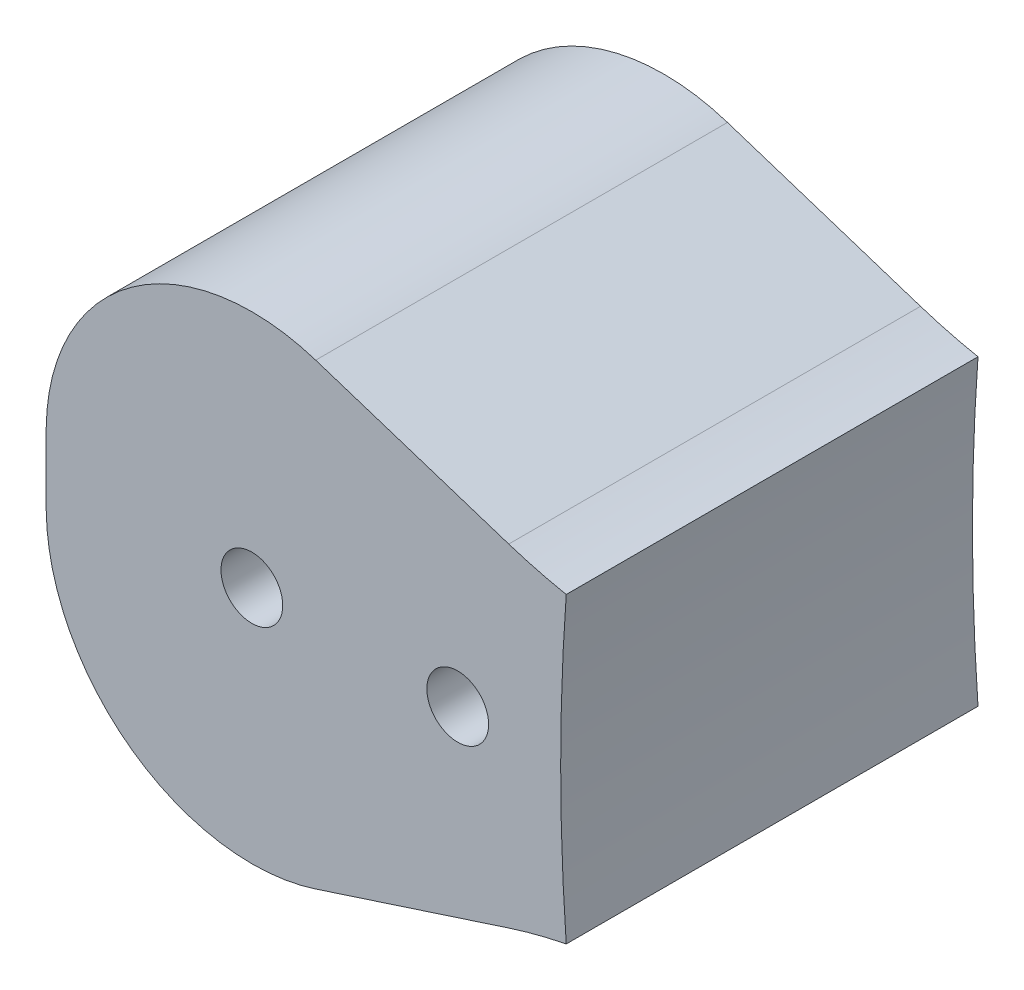
ISO-10303-21;
HEADER;
FILE_DESCRIPTION(('STEP AP214'),'2;1');
FILE_NAME('part.step','',(''),(''),'','','');
FILE_SCHEMA(('AUTOMOTIVE_DESIGN { 1 0 10303 214 1 1 1 1 }'));
ENDSEC;
DATA;
#1=APPLICATION_CONTEXT('core data for automotive mechanical design processes');
#2=APPLICATION_PROTOCOL_DEFINITION('international standard','automotive_design',2000,#1);
#3=PRODUCT_CONTEXT('',#1,'mechanical');
#4=PRODUCT('Part','Part','',(#3));
#5=PRODUCT_RELATED_PRODUCT_CATEGORY('part','',(#4));
#6=PRODUCT_DEFINITION_FORMATION('','',#4);
#7=PRODUCT_DEFINITION_CONTEXT('part definition',#1,'design');
#8=PRODUCT_DEFINITION('design','',#6,#7);
#9=PRODUCT_DEFINITION_SHAPE('','',#8);
#10=(LENGTH_UNIT() NAMED_UNIT(*) SI_UNIT(.MILLI.,.METRE.));
#11=(NAMED_UNIT(*) PLANE_ANGLE_UNIT() SI_UNIT($,.RADIAN.));
#12=(NAMED_UNIT(*) SI_UNIT($,.STERADIAN.) SOLID_ANGLE_UNIT());
#13=UNCERTAINTY_MEASURE_WITH_UNIT(LENGTH_MEASURE(1.E-05),#10,'distance_accuracy_value','');
#14=(GEOMETRIC_REPRESENTATION_CONTEXT(3) GLOBAL_UNCERTAINTY_ASSIGNED_CONTEXT((#13)) GLOBAL_UNIT_ASSIGNED_CONTEXT((#10,
#11,#12)) REPRESENTATION_CONTEXT('',''));
#15=CARTESIAN_POINT('',(0.,0.,0.));
#16=DIRECTION('',(0.,0.,1.));
#17=DIRECTION('',(1.,0.,0.));
#18=AXIS2_PLACEMENT_3D('',#15,#16,#17);
#19=CARTESIAN_POINT('',(0.,0.,20.));
#20=DIRECTION('',(0.,0.,1.));
#21=DIRECTION('',(1.,0.,0.));
#22=AXIS2_PLACEMENT_3D('',#19,#20,#21);
#23=PLANE('',#22);
#24=CARTESIAN_POINT('',(-105.,3.71230823859037E-13,20.));
#25=DIRECTION('',(0.,0.,1.));
#26=DIRECTION('',(1.,0.,0.));
#27=AXIS2_PLACEMENT_3D('',#24,#25,#26);
#28=CIRCLE('',#27,1.49999999999995);
#29=CARTESIAN_POINT('',(-103.5,3.71230823859037E-13,20.));
#30=VERTEX_POINT('',#29);
#31=EDGE_CURVE('E136',#30,#30,#28,.T.);
#32=ORIENTED_EDGE('',*,*,#31,.F.);
#33=EDGE_LOOP('',(#32));
#34=FACE_BOUND('',#33,.T.);
#35=CARTESIAN_POINT('',(0.,0.,20.));
#36=DIRECTION('',(0.,0.,-1.));
#37=DIRECTION('',(1.,0.,0.));
#38=AXIS2_PLACEMENT_3D('',#35,#36,#37);
#39=CIRCLE('',#38,100.);
#40=CARTESIAN_POINT('',(-99.7294249610009,-7.3513126003521,20.));
#41=VERTEX_POINT('',#40);
#42=CARTESIAN_POINT('',(-99.7294249610009,7.35131260035246,20.));
#43=VERTEX_POINT('',#42);
#44=EDGE_CURVE('E147',#41,#43,#39,.T.);
#45=ORIENTED_EDGE('',*,*,#44,.T.);
#46=CARTESIAN_POINT('',(-95.1056516295152,30.9016994374951,20.));
#47=DIRECTION('',(0.,0.,-1.));
#48=DIRECTION('',(1.,0.,0.));
#49=AXIS2_PLACEMENT_3D('',#46,#47,#48);
#50=CIRCLE('',#49,24.0000000000004);
#51=CARTESIAN_POINT('',(-102.522059494514,8.07634304641088,20.));
#52=VERTEX_POINT('',#51);
#53=EDGE_CURVE('E95',#43,#52,#50,.T.);
#54=ORIENTED_EDGE('',*,*,#53,.T.);
#55=DIRECTION('',(-0.951056516295158,0.309016994374935,0.));
#56=VECTOR('',#55,1.);
#57=CARTESIAN_POINT('',(-102.522059494514,8.07634304641088,20.));
#58=LINE('',#57,#56);
#59=CARTESIAN_POINT('',(-111.898526203763,11.122941761318,20.));
#60=VERTEX_POINT('',#59);
#61=EDGE_CURVE('E162',#52,#60,#58,.T.);
#62=ORIENTED_EDGE('',*,*,#61,.T.);
#63=CARTESIAN_POINT('',(-114.988696147513,1.61237659836654,20.));
#64=DIRECTION('',(0.,0.,1.));
#65=DIRECTION('',(1.,0.,0.));
#66=AXIS2_PLACEMENT_3D('',#63,#64,#65);
#67=CIRCLE('',#66,9.99999999999991);
#68=CARTESIAN_POINT('',(-124.987713203818,1.75258325909408,20.));
#69=VERTEX_POINT('',#68);
#70=EDGE_CURVE('E175',#60,#69,#67,.T.);
#71=ORIENTED_EDGE('',*,*,#70,.T.);
#72=CARTESIAN_POINT('',(0.,0.,20.));
#73=DIRECTION('',(0.,0.,1.));
#74=DIRECTION('',(1.,0.,0.));
#75=AXIS2_PLACEMENT_3D('',#72,#73,#74);
#76=CIRCLE('',#75,125.);
#77=CARTESIAN_POINT('',(-124.987713203818,-1.75258325909381,20.));
#78=VERTEX_POINT('',#77);
#79=EDGE_CURVE('E114',#69,#78,#76,.T.);
#80=ORIENTED_EDGE('',*,*,#79,.T.);
#81=CARTESIAN_POINT('',(-114.988696147513,-1.61237659836635,20.));
#82=DIRECTION('',(0.,0.,1.));
#83=DIRECTION('',(1.,0.,0.));
#84=AXIS2_PLACEMENT_3D('',#81,#82,#83);
#85=CIRCLE('',#84,9.99999999999998);
#86=CARTESIAN_POINT('',(-111.898526203763,-11.1229417613179,20.));
#87=VERTEX_POINT('',#86);
#88=EDGE_CURVE('E108',#78,#87,#85,.T.);
#89=ORIENTED_EDGE('',*,*,#88,.T.);
#90=DIRECTION('',(0.951056516295155,0.309016994374944,0.));
#91=VECTOR('',#90,1.);
#92=CARTESIAN_POINT('',(-111.898526203763,-11.1229417613179,20.));
#93=LINE('',#92,#91);
#94=CARTESIAN_POINT('',(-102.522059494514,-8.07634304641067,20.));
#95=VERTEX_POINT('',#94);
#96=EDGE_CURVE('E112',#87,#95,#93,.T.);
#97=ORIENTED_EDGE('',*,*,#96,.T.);
#98=CARTESIAN_POINT('',(-95.1056516295155,-30.9016994374944,20.));
#99=DIRECTION('',(0.,0.,-1.));
#100=DIRECTION('',(1.,0.,0.));
#101=AXIS2_PLACEMENT_3D('',#98,#99,#100);
#102=CIRCLE('',#101,24.);
#103=EDGE_CURVE('E52',#95,#41,#102,.T.);
#104=ORIENTED_EDGE('',*,*,#103,.T.);
#105=EDGE_LOOP('',(#45,#54,#62,#71,#80,#89,#97,#104));
#106=FACE_BOUND('',#105,.T.);
#107=CARTESIAN_POINT('',(-115.,3.95516952522712E-13,20.));
#108=DIRECTION('',(0.,0.,1.));
#109=DIRECTION('',(1.,0.,0.));
#110=AXIS2_PLACEMENT_3D('',#107,#108,#109);
#111=CIRCLE('',#110,1.49999999999999);
#112=CARTESIAN_POINT('',(-113.5,3.95516952522712E-13,20.));
#113=VERTEX_POINT('',#112);
#114=EDGE_CURVE('E184',#113,#113,#111,.T.);
#115=ORIENTED_EDGE('',*,*,#114,.F.);
#116=EDGE_LOOP('',(#115));
#117=FACE_BOUND('',#116,.T.);
#118=ADVANCED_FACE('F35',(#34,#106,#117),#23,.T.);
#119=CARTESIAN_POINT('',(0.,0.,0.));
#120=DIRECTION('',(0.,0.,1.));
#121=DIRECTION('',(1.,0.,0.));
#122=AXIS2_PLACEMENT_3D('',#119,#120,#121);
#123=PLANE('',#122);
#124=CARTESIAN_POINT('',(0.,0.,0.));
#125=DIRECTION('',(0.,0.,-1.));
#126=DIRECTION('',(1.,0.,0.));
#127=AXIS2_PLACEMENT_3D('',#124,#125,#126);
#128=CIRCLE('',#127,100.);
#129=CARTESIAN_POINT('',(-99.7294249610009,-7.3513126003521,0.));
#130=VERTEX_POINT('',#129);
#131=CARTESIAN_POINT('',(-99.7294249610009,7.35131260035246,0.));
#132=VERTEX_POINT('',#131);
#133=EDGE_CURVE('E132',#130,#132,#128,.T.);
#134=ORIENTED_EDGE('',*,*,#133,.F.);
#135=CARTESIAN_POINT('',(-95.1056516295155,-30.9016994374944,0.));
#136=DIRECTION('',(0.,0.,-1.));
#137=DIRECTION('',(1.,0.,0.));
#138=AXIS2_PLACEMENT_3D('',#135,#136,#137);
#139=CIRCLE('',#138,24.);
#140=CARTESIAN_POINT('',(-102.522059494514,-8.07634304641067,0.));
#141=VERTEX_POINT('',#140);
#142=EDGE_CURVE('E87',#141,#130,#139,.T.);
#143=ORIENTED_EDGE('',*,*,#142,.F.);
#144=DIRECTION('',(0.951056516295155,0.309016994374944,0.));
#145=VECTOR('',#144,1.);
#146=CARTESIAN_POINT('',(-111.898526203763,-11.1229417613179,0.));
#147=LINE('',#146,#145);
#148=CARTESIAN_POINT('',(-111.898526203763,-11.1229417613179,0.));
#149=VERTEX_POINT('',#148);
#150=EDGE_CURVE('E81',#149,#141,#147,.T.);
#151=ORIENTED_EDGE('',*,*,#150,.F.);
#152=CARTESIAN_POINT('',(-114.988696147513,-1.61237659836635,0.));
#153=DIRECTION('',(0.,0.,1.));
#154=DIRECTION('',(1.,0.,0.));
#155=AXIS2_PLACEMENT_3D('',#152,#153,#154);
#156=CIRCLE('',#155,9.99999999999998);
#157=CARTESIAN_POINT('',(-124.987713203818,-1.75258325909381,0.));
#158=VERTEX_POINT('',#157);
#159=EDGE_CURVE('E122',#158,#149,#156,.T.);
#160=ORIENTED_EDGE('',*,*,#159,.F.);
#161=CARTESIAN_POINT('',(0.,0.,0.));
#162=DIRECTION('',(0.,0.,1.));
#163=DIRECTION('',(1.,0.,0.));
#164=AXIS2_PLACEMENT_3D('',#161,#162,#163);
#165=CIRCLE('',#164,125.);
#166=CARTESIAN_POINT('',(-124.987713203818,1.75258325909408,0.));
#167=VERTEX_POINT('',#166);
#168=EDGE_CURVE('E142',#167,#158,#165,.T.);
#169=ORIENTED_EDGE('',*,*,#168,.F.);
#170=CARTESIAN_POINT('',(-114.988696147513,1.61237659836654,0.));
#171=DIRECTION('',(0.,0.,1.));
#172=DIRECTION('',(1.,0.,0.));
#173=AXIS2_PLACEMENT_3D('',#170,#171,#172);
#174=CIRCLE('',#173,9.99999999999991);
#175=CARTESIAN_POINT('',(-111.898526203763,11.122941761318,0.));
#176=VERTEX_POINT('',#175);
#177=EDGE_CURVE('E140',#176,#167,#174,.T.);
#178=ORIENTED_EDGE('',*,*,#177,.F.);
#179=DIRECTION('',(-0.951056516295158,0.309016994374935,0.));
#180=VECTOR('',#179,1.);
#181=CARTESIAN_POINT('',(-102.522059494514,8.07634304641088,0.));
#182=LINE('',#181,#180);
#183=CARTESIAN_POINT('',(-102.522059494514,8.07634304641088,0.));
#184=VERTEX_POINT('',#183);
#185=EDGE_CURVE('E138',#184,#176,#182,.T.);
#186=ORIENTED_EDGE('',*,*,#185,.F.);
#187=CARTESIAN_POINT('',(-95.1056516295152,30.9016994374951,0.));
#188=DIRECTION('',(0.,0.,-1.));
#189=DIRECTION('',(1.,0.,0.));
#190=AXIS2_PLACEMENT_3D('',#187,#188,#189);
#191=CIRCLE('',#190,24.0000000000004);
#192=EDGE_CURVE('E135',#132,#184,#191,.T.);
#193=ORIENTED_EDGE('',*,*,#192,.F.);
#194=EDGE_LOOP('',(#134,#143,#151,#160,#169,#178,#186,#193));
#195=FACE_BOUND('',#194,.T.);
#196=CARTESIAN_POINT('',(-105.,3.71230823859037E-13,0.));
#197=DIRECTION('',(0.,0.,1.));
#198=DIRECTION('',(1.,0.,0.));
#199=AXIS2_PLACEMENT_3D('',#196,#197,#198);
#200=CIRCLE('',#199,1.49999999999995);
#201=CARTESIAN_POINT('',(-103.5,3.71230823859037E-13,0.));
#202=VERTEX_POINT('',#201);
#203=EDGE_CURVE('E181',#202,#202,#200,.T.);
#204=ORIENTED_EDGE('',*,*,#203,.T.);
#205=EDGE_LOOP('',(#204));
#206=FACE_BOUND('',#205,.T.);
#207=CARTESIAN_POINT('',(-115.,3.95516952522712E-13,0.));
#208=DIRECTION('',(0.,0.,1.));
#209=DIRECTION('',(1.,0.,0.));
#210=AXIS2_PLACEMENT_3D('',#207,#208,#209);
#211=CIRCLE('',#210,1.49999999999999);
#212=CARTESIAN_POINT('',(-113.5,3.95516952522712E-13,0.));
#213=VERTEX_POINT('',#212);
#214=EDGE_CURVE('E187',#213,#213,#211,.T.);
#215=ORIENTED_EDGE('',*,*,#214,.T.);
#216=EDGE_LOOP('',(#215));
#217=FACE_BOUND('',#216,.T.);
#218=ADVANCED_FACE('F166',(#195,#206,#217),#123,.F.);
#219=CARTESIAN_POINT('',(0.,0.,20.));
#220=DIRECTION('',(0.,0.,-1.));
#221=DIRECTION('',(-1.,0.,0.));
#222=AXIS2_PLACEMENT_3D('',#219,#220,#221);
#223=CYLINDRICAL_SURFACE('',#222,100.);
#224=ORIENTED_EDGE('',*,*,#133,.T.);
#225=DIRECTION('',(0.,0.,-1.));
#226=VECTOR('',#225,1.);
#227=CARTESIAN_POINT('',(-99.7294249610009,7.35131260035246,20.));
#228=LINE('',#227,#226);
#229=EDGE_CURVE('E11',#43,#132,#228,.T.);
#230=ORIENTED_EDGE('',*,*,#229,.F.);
#231=ORIENTED_EDGE('',*,*,#44,.F.);
#232=DIRECTION('',(0.,0.,-1.));
#233=VECTOR('',#232,1.);
#234=CARTESIAN_POINT('',(-99.7294249610009,-7.3513126003521,20.));
#235=LINE('',#234,#233);
#236=EDGE_CURVE('E128',#41,#130,#235,.T.);
#237=ORIENTED_EDGE('',*,*,#236,.T.);
#238=EDGE_LOOP('',(#224,#230,#231,#237));
#239=FACE_BOUND('',#238,.T.);
#240=ADVANCED_FACE('F37',(#239),#223,.F.);
#241=CARTESIAN_POINT('',(-95.1056516295152,30.9016994374951,20.));
#242=DIRECTION('',(0.,0.,-1.));
#243=DIRECTION('',(-1.,0.,0.));
#244=AXIS2_PLACEMENT_3D('',#241,#242,#243);
#245=CYLINDRICAL_SURFACE('',#244,24.0000000000004);
#246=ORIENTED_EDGE('',*,*,#192,.T.);
#247=DIRECTION('',(0.,0.,-1.));
#248=VECTOR('',#247,1.);
#249=CARTESIAN_POINT('',(-102.522059494514,8.07634304641088,20.));
#250=LINE('',#249,#248);
#251=EDGE_CURVE('E44',#52,#184,#250,.T.);
#252=ORIENTED_EDGE('',*,*,#251,.F.);
#253=ORIENTED_EDGE('',*,*,#53,.F.);
#254=ORIENTED_EDGE('',*,*,#229,.T.);
#255=EDGE_LOOP('',(#246,#252,#253,#254));
#256=FACE_BOUND('',#255,.T.);
#257=ADVANCED_FACE('F218',(#256),#245,.F.);
#258=CARTESIAN_POINT('',(-102.522059494514,8.07634304641088,20.));
#259=DIRECTION('',(-0.309016994374935,-0.951056516295158,0.));
#260=DIRECTION('',(0.951056516295158,-0.309016994374935,0.));
#261=AXIS2_PLACEMENT_3D('',#258,#259,#260);
#262=PLANE('',#261);
#263=ORIENTED_EDGE('',*,*,#185,.T.);
#264=DIRECTION('',(0.,0.,-1.));
#265=VECTOR('',#264,1.);
#266=CARTESIAN_POINT('',(-111.898526203763,11.122941761318,20.));
#267=LINE('',#266,#265);
#268=EDGE_CURVE('E154',#60,#176,#267,.T.);
#269=ORIENTED_EDGE('',*,*,#268,.F.);
#270=ORIENTED_EDGE('',*,*,#61,.F.);
#271=ORIENTED_EDGE('',*,*,#251,.T.);
#272=EDGE_LOOP('',(#263,#269,#270,#271));
#273=FACE_BOUND('',#272,.T.);
#274=ADVANCED_FACE('F160',(#273),#262,.F.);
#275=CARTESIAN_POINT('',(-114.988696147513,1.61237659836654,20.));
#276=DIRECTION('',(0.,0.,-1.));
#277=DIRECTION('',(-1.,0.,0.));
#278=AXIS2_PLACEMENT_3D('',#275,#276,#277);
#279=CYLINDRICAL_SURFACE('',#278,9.99999999999991);
#280=ORIENTED_EDGE('',*,*,#177,.T.);
#281=DIRECTION('',(0.,0.,-1.));
#282=VECTOR('',#281,1.);
#283=CARTESIAN_POINT('',(-124.987713203818,1.75258325909408,20.));
#284=LINE('',#283,#282);
#285=EDGE_CURVE('E151',#69,#167,#284,.T.);
#286=ORIENTED_EDGE('',*,*,#285,.F.);
#287=ORIENTED_EDGE('',*,*,#70,.F.);
#288=ORIENTED_EDGE('',*,*,#268,.T.);
#289=EDGE_LOOP('',(#280,#286,#287,#288));
#290=FACE_BOUND('',#289,.T.);
#291=ADVANCED_FACE('F171',(#290),#279,.T.);
#292=CARTESIAN_POINT('',(0.,0.,20.));
#293=DIRECTION('',(0.,0.,-1.));
#294=DIRECTION('',(-1.,0.,0.));
#295=AXIS2_PLACEMENT_3D('',#292,#293,#294);
#296=CYLINDRICAL_SURFACE('',#295,125.);
#297=ORIENTED_EDGE('',*,*,#168,.T.);
#298=DIRECTION('',(0.,0.,-1.));
#299=VECTOR('',#298,1.);
#300=CARTESIAN_POINT('',(-124.987713203818,-1.75258325909381,20.));
#301=LINE('',#300,#299);
#302=EDGE_CURVE('E123',#78,#158,#301,.T.);
#303=ORIENTED_EDGE('',*,*,#302,.F.);
#304=ORIENTED_EDGE('',*,*,#79,.F.);
#305=ORIENTED_EDGE('',*,*,#285,.T.);
#306=EDGE_LOOP('',(#297,#303,#304,#305));
#307=FACE_BOUND('',#306,.T.);
#308=ADVANCED_FACE('F174',(#307),#296,.T.);
#309=CARTESIAN_POINT('',(-114.988696147513,-1.61237659836635,20.));
#310=DIRECTION('',(0.,0.,-1.));
#311=DIRECTION('',(-1.,0.,0.));
#312=AXIS2_PLACEMENT_3D('',#309,#310,#311);
#313=CYLINDRICAL_SURFACE('',#312,9.99999999999998);
#314=ORIENTED_EDGE('',*,*,#159,.T.);
#315=DIRECTION('',(0.,0.,-1.));
#316=VECTOR('',#315,1.);
#317=CARTESIAN_POINT('',(-111.898526203763,-11.1229417613179,20.));
#318=LINE('',#317,#316);
#319=EDGE_CURVE('E119',#87,#149,#318,.T.);
#320=ORIENTED_EDGE('',*,*,#319,.F.);
#321=ORIENTED_EDGE('',*,*,#88,.F.);
#322=ORIENTED_EDGE('',*,*,#302,.T.);
#323=EDGE_LOOP('',(#314,#320,#321,#322));
#324=FACE_BOUND('',#323,.T.);
#325=ADVANCED_FACE('F120',(#324),#313,.T.);
#326=CARTESIAN_POINT('',(-111.898526203763,-11.1229417613179,20.));
#327=DIRECTION('',(-0.309016994374944,0.951056516295155,0.));
#328=DIRECTION('',(-0.951056516295155,-0.309016994374944,0.));
#329=AXIS2_PLACEMENT_3D('',#326,#327,#328);
#330=PLANE('',#329);
#331=ORIENTED_EDGE('',*,*,#150,.T.);
#332=DIRECTION('',(0.,0.,-1.));
#333=VECTOR('',#332,1.);
#334=CARTESIAN_POINT('',(-102.522059494514,-8.07634304641067,20.));
#335=LINE('',#334,#333);
#336=EDGE_CURVE('E124',#95,#141,#335,.T.);
#337=ORIENTED_EDGE('',*,*,#336,.F.);
#338=ORIENTED_EDGE('',*,*,#96,.F.);
#339=ORIENTED_EDGE('',*,*,#319,.T.);
#340=EDGE_LOOP('',(#331,#337,#338,#339));
#341=FACE_BOUND('',#340,.T.);
#342=ADVANCED_FACE('F126',(#341),#330,.F.);
#343=CARTESIAN_POINT('',(-95.1056516295155,-30.9016994374944,20.));
#344=DIRECTION('',(0.,0.,-1.));
#345=DIRECTION('',(-1.,0.,0.));
#346=AXIS2_PLACEMENT_3D('',#343,#344,#345);
#347=CYLINDRICAL_SURFACE('',#346,24.);
#348=ORIENTED_EDGE('',*,*,#142,.T.);
#349=ORIENTED_EDGE('',*,*,#236,.F.);
#350=ORIENTED_EDGE('',*,*,#103,.F.);
#351=ORIENTED_EDGE('',*,*,#336,.T.);
#352=EDGE_LOOP('',(#348,#349,#350,#351));
#353=FACE_BOUND('',#352,.T.);
#354=ADVANCED_FACE('F206',(#353),#347,.F.);
#355=CARTESIAN_POINT('',(-105.,3.71230823859037E-13,20.));
#356=DIRECTION('',(0.,0.,-1.));
#357=DIRECTION('',(-1.,0.,0.));
#358=AXIS2_PLACEMENT_3D('',#355,#356,#357);
#359=CYLINDRICAL_SURFACE('',#358,1.49999999999995);
#360=ORIENTED_EDGE('',*,*,#203,.F.);
#361=EDGE_LOOP('',(#360));
#362=FACE_BOUND('',#361,.T.);
#363=ORIENTED_EDGE('',*,*,#31,.T.);
#364=EDGE_LOOP('',(#363));
#365=FACE_BOUND('',#364,.T.);
#366=ADVANCED_FACE('F203',(#362,#365),#359,.F.);
#367=CARTESIAN_POINT('',(-115.,3.95516952522712E-13,20.));
#368=DIRECTION('',(0.,0.,-1.));
#369=DIRECTION('',(-1.,0.,0.));
#370=AXIS2_PLACEMENT_3D('',#367,#368,#369);
#371=CYLINDRICAL_SURFACE('',#370,1.49999999999999);
#372=ORIENTED_EDGE('',*,*,#214,.F.);
#373=EDGE_LOOP('',(#372));
#374=FACE_BOUND('',#373,.T.);
#375=ORIENTED_EDGE('',*,*,#114,.T.);
#376=EDGE_LOOP('',(#375));
#377=FACE_BOUND('',#376,.T.);
#378=ADVANCED_FACE('F193',(#374,#377),#371,.F.);
#379=CLOSED_SHELL('',(#118,#218,#240,#257,#274,#291,#308,#325,#342,#354,#366,#378));
#380=MANIFOLD_SOLID_BREP('B2',#379);
#381=ADVANCED_BREP_SHAPE_REPRESENTATION('',(#18,#380),#14);
#382=SHAPE_DEFINITION_REPRESENTATION(#9,#381);
ENDSEC;
END-ISO-10303-21;
